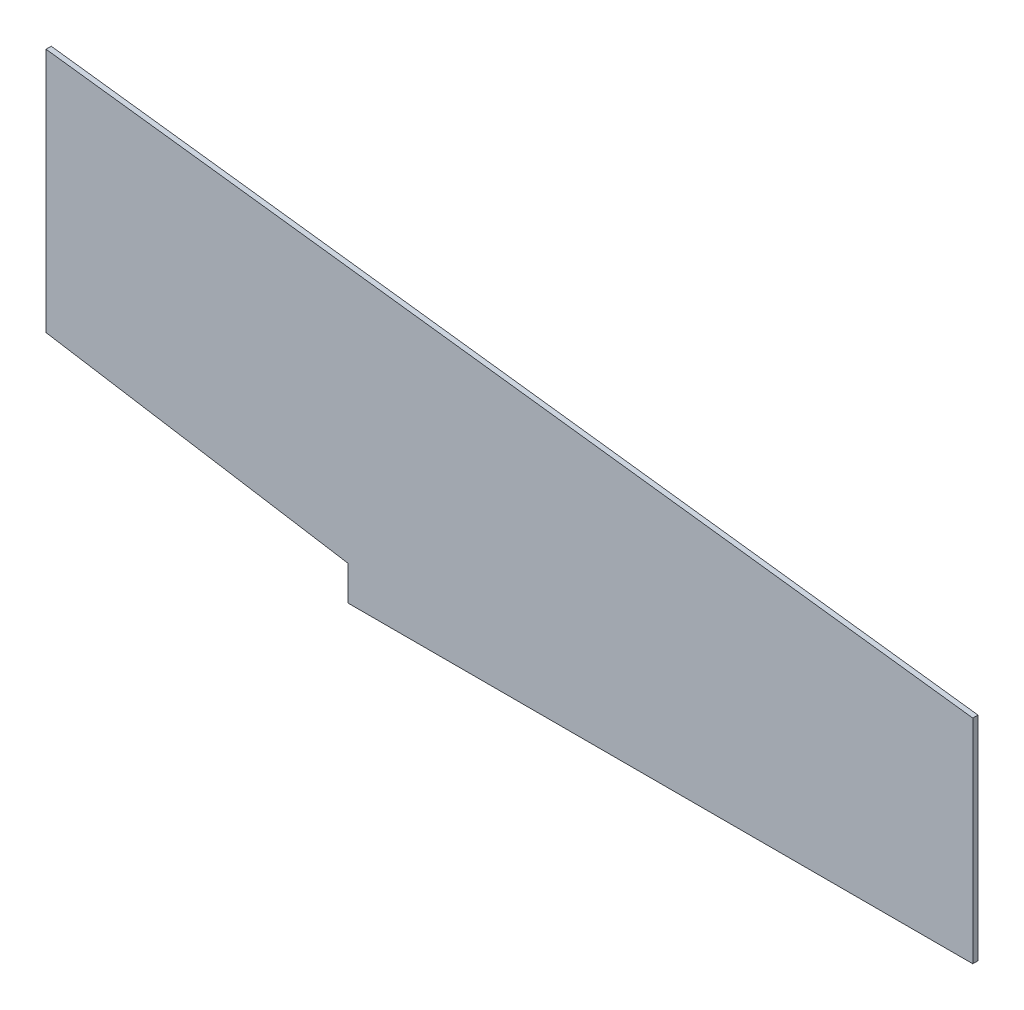
ISO-10303-21;
HEADER;
FILE_DESCRIPTION(('STEP AP214'),'2;1');
FILE_NAME('part.step','',(''),(''),'','','');
FILE_SCHEMA(('AUTOMOTIVE_DESIGN { 1 0 10303 214 1 1 1 1 }'));
ENDSEC;
DATA;
#1=APPLICATION_CONTEXT('core data for automotive mechanical design processes');
#2=APPLICATION_PROTOCOL_DEFINITION('international standard','automotive_design',2000,#1);
#3=PRODUCT_CONTEXT('',#1,'mechanical');
#4=PRODUCT('Part','Part','',(#3));
#5=PRODUCT_RELATED_PRODUCT_CATEGORY('part','',(#4));
#6=PRODUCT_DEFINITION_FORMATION('','',#4);
#7=PRODUCT_DEFINITION_CONTEXT('part definition',#1,'design');
#8=PRODUCT_DEFINITION('design','',#6,#7);
#9=PRODUCT_DEFINITION_SHAPE('','',#8);
#10=(LENGTH_UNIT() NAMED_UNIT(*) SI_UNIT(.MILLI.,.METRE.));
#11=(NAMED_UNIT(*) PLANE_ANGLE_UNIT() SI_UNIT($,.RADIAN.));
#12=(NAMED_UNIT(*) SI_UNIT($,.STERADIAN.) SOLID_ANGLE_UNIT());
#13=UNCERTAINTY_MEASURE_WITH_UNIT(LENGTH_MEASURE(1.E-05),#10,'distance_accuracy_value','');
#14=(GEOMETRIC_REPRESENTATION_CONTEXT(3) GLOBAL_UNCERTAINTY_ASSIGNED_CONTEXT((#13)) GLOBAL_UNIT_ASSIGNED_CONTEXT((#10,
#11,#12)) REPRESENTATION_CONTEXT('',''));
#15=CARTESIAN_POINT('',(0.,0.,0.));
#16=DIRECTION('',(0.,0.,1.));
#17=DIRECTION('',(1.,0.,0.));
#18=AXIS2_PLACEMENT_3D('',#15,#16,#17);
#19=CARTESIAN_POINT('',(-183.714285714286,177.734435562925,2.));
#20=DIRECTION('',(-0.124034734589209,-0.992277876713668,0.));
#21=DIRECTION('',(0.992277876713668,-0.124034734589209,0.));
#22=AXIS2_PLACEMENT_3D('',#19,#20,#21);
#23=PLANE('',#22);
#24=DIRECTION('',(-0.992277876713668,0.124034734589208,0.));
#25=VECTOR('',#24,1.);
#26=CARTESIAN_POINT('',(-183.714285714286,177.734435562925,0.));
#27=LINE('',#26,#25);
#28=CARTESIAN_POINT('',(172.285714285714,133.234435562925,0.));
#29=VERTEX_POINT('',#28);
#30=CARTESIAN_POINT('',(-183.714285714286,177.734435562925,0.));
#31=VERTEX_POINT('',#30);
#32=EDGE_CURVE('E117',#29,#31,#27,.T.);
#33=ORIENTED_EDGE('',*,*,#32,.T.);
#34=DIRECTION('',(0.,0.,-1.));
#35=VECTOR('',#34,1.);
#36=CARTESIAN_POINT('',(-183.714285714286,177.734435562925,2.));
#37=LINE('',#36,#35);
#38=CARTESIAN_POINT('',(-183.714285714286,177.734435562925,2.));
#39=VERTEX_POINT('',#38);
#40=EDGE_CURVE('E11',#39,#31,#37,.T.);
#41=ORIENTED_EDGE('',*,*,#40,.F.);
#42=DIRECTION('',(-0.992277876713668,0.124034734589208,0.));
#43=VECTOR('',#42,1.);
#44=CARTESIAN_POINT('',(-183.714285714286,177.734435562925,2.));
#45=LINE('',#44,#43);
#46=CARTESIAN_POINT('',(172.285714285714,133.234435562925,2.));
#47=VERTEX_POINT('',#46);
#48=EDGE_CURVE('E127',#47,#39,#45,.T.);
#49=ORIENTED_EDGE('',*,*,#48,.F.);
#50=DIRECTION('',(0.,0.,-1.));
#51=VECTOR('',#50,1.);
#52=CARTESIAN_POINT('',(172.285714285714,133.234435562925,2.));
#53=LINE('',#52,#51);
#54=EDGE_CURVE('E113',#47,#29,#53,.T.);
#55=ORIENTED_EDGE('',*,*,#54,.T.);
#56=EDGE_LOOP('',(#33,#41,#49,#55));
#57=FACE_BOUND('',#56,.T.);
#58=ADVANCED_FACE('F33',(#57),#23,.F.);
#59=CARTESIAN_POINT('',(-183.714285714286,83.4658977478539,2.));
#60=DIRECTION('',(1.,0.,0.));
#61=DIRECTION('',(0.,1.,0.));
#62=AXIS2_PLACEMENT_3D('',#59,#60,#61);
#63=PLANE('',#62);
#64=DIRECTION('',(0.,-1.,0.));
#65=VECTOR('',#64,1.);
#66=CARTESIAN_POINT('',(-183.714285714286,83.4658977478539,0.));
#67=LINE('',#66,#65);
#68=CARTESIAN_POINT('',(-183.714285714286,83.4658977478539,0.));
#69=VERTEX_POINT('',#68);
#70=EDGE_CURVE('E120',#31,#69,#67,.T.);
#71=ORIENTED_EDGE('',*,*,#70,.T.);
#72=DIRECTION('',(0.,0.,-1.));
#73=VECTOR('',#72,1.);
#74=CARTESIAN_POINT('',(-183.714285714286,83.4658977478539,2.));
#75=LINE('',#74,#73);
#76=CARTESIAN_POINT('',(-183.714285714286,83.4658977478539,2.));
#77=VERTEX_POINT('',#76);
#78=EDGE_CURVE('E41',#77,#69,#75,.T.);
#79=ORIENTED_EDGE('',*,*,#78,.F.);
#80=DIRECTION('',(0.,-1.,0.));
#81=VECTOR('',#80,1.);
#82=CARTESIAN_POINT('',(-183.714285714286,83.4658977478539,2.));
#83=LINE('',#82,#81);
#84=EDGE_CURVE('E86',#39,#77,#83,.T.);
#85=ORIENTED_EDGE('',*,*,#84,.F.);
#86=ORIENTED_EDGE('',*,*,#40,.T.);
#87=EDGE_LOOP('',(#71,#79,#85,#86));
#88=FACE_BOUND('',#87,.T.);
#89=ADVANCED_FACE('F151',(#88),#63,.F.);
#90=CARTESIAN_POINT('',(-67.7142857142858,64.7311732284148,2.));
#91=DIRECTION('',(0.159440191703083,0.987207589754903,0.));
#92=DIRECTION('',(-0.987207589754903,0.159440191703083,0.));
#93=AXIS2_PLACEMENT_3D('',#90,#91,#92);
#94=PLANE('',#93);
#95=DIRECTION('',(0.987207589754903,-0.159440191703083,0.));
#96=VECTOR('',#95,1.);
#97=CARTESIAN_POINT('',(-67.7142857142858,64.7311732284148,0.));
#98=LINE('',#97,#96);
#99=CARTESIAN_POINT('',(-67.7142857142858,64.7311732284148,0.));
#100=VERTEX_POINT('',#99);
#101=EDGE_CURVE('E122',#69,#100,#98,.T.);
#102=ORIENTED_EDGE('',*,*,#101,.T.);
#103=DIRECTION('',(0.,0.,-1.));
#104=VECTOR('',#103,1.);
#105=CARTESIAN_POINT('',(-67.7142857142858,64.7311732284148,2.));
#106=LINE('',#105,#104);
#107=CARTESIAN_POINT('',(-67.7142857142858,64.7311732284148,2.));
#108=VERTEX_POINT('',#107);
#109=EDGE_CURVE('E108',#108,#100,#106,.T.);
#110=ORIENTED_EDGE('',*,*,#109,.F.);
#111=DIRECTION('',(0.987207589754903,-0.159440191703083,0.));
#112=VECTOR('',#111,1.);
#113=CARTESIAN_POINT('',(-67.7142857142858,64.7311732284148,2.));
#114=LINE('',#113,#112);
#115=EDGE_CURVE('E99',#77,#108,#114,.T.);
#116=ORIENTED_EDGE('',*,*,#115,.F.);
#117=ORIENTED_EDGE('',*,*,#78,.T.);
#118=EDGE_LOOP('',(#102,#110,#116,#117));
#119=FACE_BOUND('',#118,.T.);
#120=ADVANCED_FACE('F133',(#119),#94,.F.);
#121=CARTESIAN_POINT('',(-67.7142857142858,51.4916164742417,2.));
#122=DIRECTION('',(1.,0.,0.));
#123=DIRECTION('',(0.,0.,-1.));
#124=AXIS2_PLACEMENT_3D('',#121,#122,#123);
#125=PLANE('',#124);
#126=DIRECTION('',(0.,-1.,0.));
#127=VECTOR('',#126,1.);
#128=CARTESIAN_POINT('',(-67.7142857142858,51.4916164742417,0.));
#129=LINE('',#128,#127);
#130=CARTESIAN_POINT('',(-67.7142857142858,51.4916164742417,0.));
#131=VERTEX_POINT('',#130);
#132=EDGE_CURVE('E107',#100,#131,#129,.T.);
#133=ORIENTED_EDGE('',*,*,#132,.T.);
#134=DIRECTION('',(0.,0.,-1.));
#135=VECTOR('',#134,1.);
#136=CARTESIAN_POINT('',(-67.7142857142858,51.4916164742417,2.));
#137=LINE('',#136,#135);
#138=CARTESIAN_POINT('',(-67.7142857142858,51.4916164742417,2.));
#139=VERTEX_POINT('',#138);
#140=EDGE_CURVE('E104',#139,#131,#137,.T.);
#141=ORIENTED_EDGE('',*,*,#140,.F.);
#142=DIRECTION('',(0.,-1.,0.));
#143=VECTOR('',#142,1.);
#144=CARTESIAN_POINT('',(-67.7142857142858,51.4916164742417,2.));
#145=LINE('',#144,#143);
#146=EDGE_CURVE('E93',#108,#139,#145,.T.);
#147=ORIENTED_EDGE('',*,*,#146,.F.);
#148=ORIENTED_EDGE('',*,*,#109,.T.);
#149=EDGE_LOOP('',(#133,#141,#147,#148));
#150=FACE_BOUND('',#149,.T.);
#151=ADVANCED_FACE('F105',(#150),#125,.F.);
#152=CARTESIAN_POINT('',(172.285714285714,51.4916164742418,2.));
#153=DIRECTION('',(0.,1.,0.));
#154=DIRECTION('',(-1.,0.,0.));
#155=AXIS2_PLACEMENT_3D('',#152,#153,#154);
#156=PLANE('',#155);
#157=DIRECTION('',(1.,0.,0.));
#158=VECTOR('',#157,1.);
#159=CARTESIAN_POINT('',(172.285714285714,51.4916164742418,0.));
#160=LINE('',#159,#158);
#161=CARTESIAN_POINT('',(172.285714285714,51.4916164742418,0.));
#162=VERTEX_POINT('',#161);
#163=EDGE_CURVE('E72',#131,#162,#160,.T.);
#164=ORIENTED_EDGE('',*,*,#163,.T.);
#165=DIRECTION('',(0.,0.,-1.));
#166=VECTOR('',#165,1.);
#167=CARTESIAN_POINT('',(172.285714285714,51.4916164742418,2.));
#168=LINE('',#167,#166);
#169=CARTESIAN_POINT('',(172.285714285714,51.4916164742418,2.));
#170=VERTEX_POINT('',#169);
#171=EDGE_CURVE('E109',#170,#162,#168,.T.);
#172=ORIENTED_EDGE('',*,*,#171,.F.);
#173=DIRECTION('',(1.,0.,0.));
#174=VECTOR('',#173,1.);
#175=CARTESIAN_POINT('',(172.285714285714,51.4916164742418,2.));
#176=LINE('',#175,#174);
#177=EDGE_CURVE('E97',#139,#170,#176,.T.);
#178=ORIENTED_EDGE('',*,*,#177,.F.);
#179=ORIENTED_EDGE('',*,*,#140,.T.);
#180=EDGE_LOOP('',(#164,#172,#178,#179));
#181=FACE_BOUND('',#180,.T.);
#182=ADVANCED_FACE('F111',(#181),#156,.F.);
#183=CARTESIAN_POINT('',(172.285714285714,133.234435562925,2.));
#184=DIRECTION('',(-1.,0.,0.));
#185=DIRECTION('',(0.,-1.,0.));
#186=AXIS2_PLACEMENT_3D('',#183,#184,#185);
#187=PLANE('',#186);
#188=DIRECTION('',(0.,1.,0.));
#189=VECTOR('',#188,1.);
#190=CARTESIAN_POINT('',(172.285714285714,133.234435562925,0.));
#191=LINE('',#190,#189);
#192=EDGE_CURVE('E78',#162,#29,#191,.T.);
#193=ORIENTED_EDGE('',*,*,#192,.T.);
#194=ORIENTED_EDGE('',*,*,#54,.F.);
#195=DIRECTION('',(0.,1.,0.));
#196=VECTOR('',#195,1.);
#197=CARTESIAN_POINT('',(172.285714285714,133.234435562925,2.));
#198=LINE('',#197,#196);
#199=EDGE_CURVE('E49',#170,#47,#198,.T.);
#200=ORIENTED_EDGE('',*,*,#199,.F.);
#201=ORIENTED_EDGE('',*,*,#171,.T.);
#202=EDGE_LOOP('',(#193,#194,#200,#201));
#203=FACE_BOUND('',#202,.T.);
#204=ADVANCED_FACE('F140',(#203),#187,.F.);
#205=CARTESIAN_POINT('',(0.,0.,2.));
#206=DIRECTION('',(0.,0.,-1.));
#207=DIRECTION('',(-1.,0.,0.));
#208=AXIS2_PLACEMENT_3D('',#205,#206,#207);
#209=PLANE('',#208);
#210=ORIENTED_EDGE('',*,*,#48,.T.);
#211=ORIENTED_EDGE('',*,*,#84,.T.);
#212=ORIENTED_EDGE('',*,*,#115,.T.);
#213=ORIENTED_EDGE('',*,*,#146,.T.);
#214=ORIENTED_EDGE('',*,*,#177,.T.);
#215=ORIENTED_EDGE('',*,*,#199,.T.);
#216=EDGE_LOOP('',(#210,#211,#212,#213,#214,#215));
#217=FACE_BOUND('',#216,.T.);
#218=ADVANCED_FACE('F95',(#217),#209,.F.);
#219=CARTESIAN_POINT('',(0.,0.,0.));
#220=DIRECTION('',(0.,0.,-1.));
#221=DIRECTION('',(-1.,0.,0.));
#222=AXIS2_PLACEMENT_3D('',#219,#220,#221);
#223=PLANE('',#222);
#224=ORIENTED_EDGE('',*,*,#32,.F.);
#225=ORIENTED_EDGE('',*,*,#192,.F.);
#226=ORIENTED_EDGE('',*,*,#163,.F.);
#227=ORIENTED_EDGE('',*,*,#132,.F.);
#228=ORIENTED_EDGE('',*,*,#101,.F.);
#229=ORIENTED_EDGE('',*,*,#70,.F.);
#230=EDGE_LOOP('',(#224,#225,#226,#227,#228,#229));
#231=FACE_BOUND('',#230,.T.);
#232=ADVANCED_FACE('F136',(#231),#223,.T.);
#233=CLOSED_SHELL('',(#58,#89,#120,#151,#182,#204,#218,#232));
#234=MANIFOLD_SOLID_BREP('B2',#233);
#235=ADVANCED_BREP_SHAPE_REPRESENTATION('',(#18,#234),#14);
#236=SHAPE_DEFINITION_REPRESENTATION(#9,#235);
ENDSEC;
END-ISO-10303-21;
